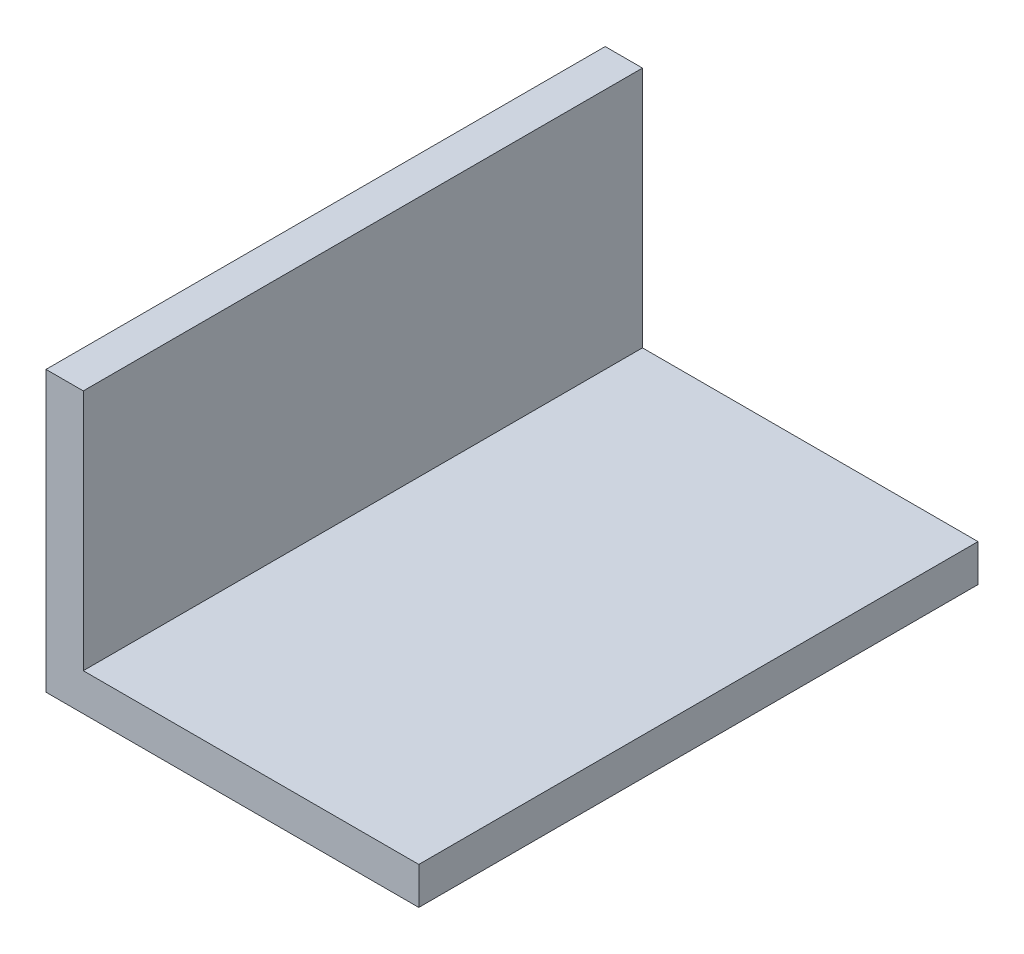
ISO-10303-21;
HEADER;
FILE_DESCRIPTION(('STEP AP214'),'2;1');
FILE_NAME('part.step','',(''),(''),'','','');
FILE_SCHEMA(('AUTOMOTIVE_DESIGN { 1 0 10303 214 1 1 1 1 }'));
ENDSEC;
DATA;
#1=APPLICATION_CONTEXT('core data for automotive mechanical design processes');
#2=APPLICATION_PROTOCOL_DEFINITION('international standard','automotive_design',2000,#1);
#3=PRODUCT_CONTEXT('',#1,'mechanical');
#4=PRODUCT('Part','Part','',(#3));
#5=PRODUCT_RELATED_PRODUCT_CATEGORY('part','',(#4));
#6=PRODUCT_DEFINITION_FORMATION('','',#4);
#7=PRODUCT_DEFINITION_CONTEXT('part definition',#1,'design');
#8=PRODUCT_DEFINITION('design','',#6,#7);
#9=PRODUCT_DEFINITION_SHAPE('','',#8);
#10=(LENGTH_UNIT() NAMED_UNIT(*) SI_UNIT(.MILLI.,.METRE.));
#11=(NAMED_UNIT(*) PLANE_ANGLE_UNIT() SI_UNIT($,.RADIAN.));
#12=(NAMED_UNIT(*) SI_UNIT($,.STERADIAN.) SOLID_ANGLE_UNIT());
#13=UNCERTAINTY_MEASURE_WITH_UNIT(LENGTH_MEASURE(1.E-05),#10,'distance_accuracy_value','');
#14=(GEOMETRIC_REPRESENTATION_CONTEXT(3) GLOBAL_UNCERTAINTY_ASSIGNED_CONTEXT((#13)) GLOBAL_UNIT_ASSIGNED_CONTEXT((#10,
#11,#12)) REPRESENTATION_CONTEXT('',''));
#15=CARTESIAN_POINT('',(0.,0.,0.));
#16=DIRECTION('',(0.,0.,1.));
#17=DIRECTION('',(1.,0.,0.));
#18=AXIS2_PLACEMENT_3D('',#15,#16,#17);
#19=CARTESIAN_POINT('',(34.,20.4000000000002,85.));
#20=DIRECTION('',(0.,0.,1.));
#21=DIRECTION('',(0.,-1.,0.));
#22=AXIS2_PLACEMENT_3D('',#19,#20,#21);
#23=PLANE('',#22);
#24=DIRECTION('',(1.,0.,0.));
#25=VECTOR('',#24,1.);
#26=CARTESIAN_POINT('',(68.,-1.69999999999982,85.));
#27=LINE('',#26,#25);
#28=CARTESIAN_POINT('',(37.4,-1.69999999999982,85.));
#29=VERTEX_POINT('',#28);
#30=CARTESIAN_POINT('',(68.,-1.69999999999982,85.));
#31=VERTEX_POINT('',#30);
#32=EDGE_CURVE('E50',#29,#31,#27,.T.);
#33=ORIENTED_EDGE('',*,*,#32,.F.);
#34=DIRECTION('',(0.,-1.,0.));
#35=VECTOR('',#34,1.);
#36=CARTESIAN_POINT('',(37.4,20.4000000000002,85.));
#37=LINE('',#36,#35);
#38=CARTESIAN_POINT('',(37.4,20.4000000000002,85.));
#39=VERTEX_POINT('',#38);
#40=EDGE_CURVE('E136',#39,#29,#37,.T.);
#41=ORIENTED_EDGE('',*,*,#40,.F.);
#42=DIRECTION('',(1.,0.,0.));
#43=VECTOR('',#42,1.);
#44=CARTESIAN_POINT('',(34.,20.4000000000002,85.));
#45=LINE('',#44,#43);
#46=CARTESIAN_POINT('',(34.,20.4000000000002,85.));
#47=VERTEX_POINT('',#46);
#48=EDGE_CURVE('E11',#47,#39,#45,.T.);
#49=ORIENTED_EDGE('',*,*,#48,.F.);
#50=DIRECTION('',(0.,-1.,0.));
#51=VECTOR('',#50,1.);
#52=CARTESIAN_POINT('',(34.,20.4000000000002,85.));
#53=LINE('',#52,#51);
#54=CARTESIAN_POINT('',(34.,-5.09999999999982,85.));
#55=VERTEX_POINT('',#54);
#56=EDGE_CURVE('E120',#47,#55,#53,.T.);
#57=ORIENTED_EDGE('',*,*,#56,.T.);
#58=DIRECTION('',(1.,0.,0.));
#59=VECTOR('',#58,1.);
#60=CARTESIAN_POINT('',(34.,-5.09999999999982,85.));
#61=LINE('',#60,#59);
#62=CARTESIAN_POINT('',(68.,-5.09999999999982,85.));
#63=VERTEX_POINT('',#62);
#64=EDGE_CURVE('E37',#55,#63,#61,.T.);
#65=ORIENTED_EDGE('',*,*,#64,.T.);
#66=DIRECTION('',(0.,-1.,0.));
#67=VECTOR('',#66,1.);
#68=CARTESIAN_POINT('',(68.,20.4000000000002,85.));
#69=LINE('',#68,#67);
#70=EDGE_CURVE('E124',#31,#63,#69,.T.);
#71=ORIENTED_EDGE('',*,*,#70,.F.);
#72=EDGE_LOOP('',(#33,#41,#49,#57,#65,#71));
#73=FACE_BOUND('',#72,.T.);
#74=ADVANCED_FACE('F34',(#73),#23,.T.);
#75=CARTESIAN_POINT('',(34.,20.4000000000002,34.));
#76=DIRECTION('',(0.,1.,0.));
#77=DIRECTION('',(0.,0.,1.));
#78=AXIS2_PLACEMENT_3D('',#75,#76,#77);
#79=PLANE('',#78);
#80=DIRECTION('',(0.,0.,1.));
#81=VECTOR('',#80,1.);
#82=CARTESIAN_POINT('',(37.4,20.4000000000002,34.));
#83=LINE('',#82,#81);
#84=CARTESIAN_POINT('',(37.4,20.4000000000002,34.));
#85=VERTEX_POINT('',#84);
#86=EDGE_CURVE('E98',#85,#39,#83,.T.);
#87=ORIENTED_EDGE('',*,*,#86,.F.);
#88=DIRECTION('',(1.,0.,0.));
#89=VECTOR('',#88,1.);
#90=CARTESIAN_POINT('',(34.,20.4000000000002,34.));
#91=LINE('',#90,#89);
#92=CARTESIAN_POINT('',(34.,20.4000000000002,34.));
#93=VERTEX_POINT('',#92);
#94=EDGE_CURVE('E42',#93,#85,#91,.T.);
#95=ORIENTED_EDGE('',*,*,#94,.F.);
#96=DIRECTION('',(0.,0.,1.));
#97=VECTOR('',#96,1.);
#98=CARTESIAN_POINT('',(34.,20.4000000000002,34.));
#99=LINE('',#98,#97);
#100=EDGE_CURVE('E127',#93,#47,#99,.T.);
#101=ORIENTED_EDGE('',*,*,#100,.T.);
#102=ORIENTED_EDGE('',*,*,#48,.T.);
#103=EDGE_LOOP('',(#87,#95,#101,#102));
#104=FACE_BOUND('',#103,.T.);
#105=ADVANCED_FACE('F107',(#104),#79,.T.);
#106=CARTESIAN_POINT('',(34.,-5.09999999999982,34.));
#107=DIRECTION('',(0.,0.,-1.));
#108=DIRECTION('',(-1.,0.,0.));
#109=AXIS2_PLACEMENT_3D('',#106,#107,#108);
#110=PLANE('',#109);
#111=DIRECTION('',(1.,0.,0.));
#112=VECTOR('',#111,1.);
#113=CARTESIAN_POINT('',(68.,-1.69999999999982,34.));
#114=LINE('',#113,#112);
#115=CARTESIAN_POINT('',(37.4,-1.69999999999982,34.));
#116=VERTEX_POINT('',#115);
#117=CARTESIAN_POINT('',(68.,-1.69999999999982,34.));
#118=VERTEX_POINT('',#117);
#119=EDGE_CURVE('E104',#116,#118,#114,.T.);
#120=ORIENTED_EDGE('',*,*,#119,.T.);
#121=DIRECTION('',(0.,1.,0.));
#122=VECTOR('',#121,1.);
#123=CARTESIAN_POINT('',(68.,-5.09999999999982,34.));
#124=LINE('',#123,#122);
#125=CARTESIAN_POINT('',(68.,-5.09999999999982,34.));
#126=VERTEX_POINT('',#125);
#127=EDGE_CURVE('E117',#126,#118,#124,.T.);
#128=ORIENTED_EDGE('',*,*,#127,.F.);
#129=DIRECTION('',(1.,0.,0.));
#130=VECTOR('',#129,1.);
#131=CARTESIAN_POINT('',(34.,-5.09999999999982,34.));
#132=LINE('',#131,#130);
#133=CARTESIAN_POINT('',(34.,-5.09999999999982,34.));
#134=VERTEX_POINT('',#133);
#135=EDGE_CURVE('E74',#134,#126,#132,.T.);
#136=ORIENTED_EDGE('',*,*,#135,.F.);
#137=DIRECTION('',(0.,1.,0.));
#138=VECTOR('',#137,1.);
#139=CARTESIAN_POINT('',(34.,-5.09999999999982,34.));
#140=LINE('',#139,#138);
#141=EDGE_CURVE('E113',#134,#93,#140,.T.);
#142=ORIENTED_EDGE('',*,*,#141,.T.);
#143=ORIENTED_EDGE('',*,*,#94,.T.);
#144=DIRECTION('',(0.,-1.,0.));
#145=VECTOR('',#144,1.);
#146=CARTESIAN_POINT('',(37.4,20.4000000000002,34.));
#147=LINE('',#146,#145);
#148=EDGE_CURVE('E94',#85,#116,#147,.T.);
#149=ORIENTED_EDGE('',*,*,#148,.T.);
#150=EDGE_LOOP('',(#120,#128,#136,#142,#143,#149));
#151=FACE_BOUND('',#150,.T.);
#152=ADVANCED_FACE('F111',(#151),#110,.T.);
#153=CARTESIAN_POINT('',(34.,-5.09999999999982,85.));
#154=DIRECTION('',(0.,-1.,0.));
#155=DIRECTION('',(0.,0.,-1.));
#156=AXIS2_PLACEMENT_3D('',#153,#154,#155);
#157=PLANE('',#156);
#158=DIRECTION('',(0.,0.,-1.));
#159=VECTOR('',#158,1.);
#160=CARTESIAN_POINT('',(68.,-5.09999999999982,85.));
#161=LINE('',#160,#159);
#162=EDGE_CURVE('E121',#63,#126,#161,.T.);
#163=ORIENTED_EDGE('',*,*,#162,.F.);
#164=ORIENTED_EDGE('',*,*,#64,.F.);
#165=DIRECTION('',(0.,0.,-1.));
#166=VECTOR('',#165,1.);
#167=CARTESIAN_POINT('',(34.,-5.09999999999982,85.));
#168=LINE('',#167,#166);
#169=EDGE_CURVE('E130',#55,#134,#168,.T.);
#170=ORIENTED_EDGE('',*,*,#169,.T.);
#171=ORIENTED_EDGE('',*,*,#135,.T.);
#172=EDGE_LOOP('',(#163,#164,#170,#171));
#173=FACE_BOUND('',#172,.T.);
#174=ADVANCED_FACE('F141',(#173),#157,.T.);
#175=CARTESIAN_POINT('',(34.,0.,0.));
#176=DIRECTION('',(1.,0.,0.));
#177=DIRECTION('',(0.,0.,-1.));
#178=AXIS2_PLACEMENT_3D('',#175,#176,#177);
#179=PLANE('',#178);
#180=ORIENTED_EDGE('',*,*,#56,.F.);
#181=ORIENTED_EDGE('',*,*,#100,.F.);
#182=ORIENTED_EDGE('',*,*,#141,.F.);
#183=ORIENTED_EDGE('',*,*,#169,.F.);
#184=EDGE_LOOP('',(#180,#181,#182,#183));
#185=FACE_BOUND('',#184,.T.);
#186=ADVANCED_FACE('F143',(#185),#179,.F.);
#187=CARTESIAN_POINT('',(68.,0.,0.));
#188=DIRECTION('',(1.,0.,0.));
#189=DIRECTION('',(0.,0.,-1.));
#190=AXIS2_PLACEMENT_3D('',#187,#188,#189);
#191=PLANE('',#190);
#192=DIRECTION('',(0.,0.,1.));
#193=VECTOR('',#192,1.);
#194=CARTESIAN_POINT('',(68.,-1.69999999999982,34.));
#195=LINE('',#194,#193);
#196=EDGE_CURVE('E126',#118,#31,#195,.T.);
#197=ORIENTED_EDGE('',*,*,#196,.T.);
#198=ORIENTED_EDGE('',*,*,#70,.T.);
#199=ORIENTED_EDGE('',*,*,#162,.T.);
#200=ORIENTED_EDGE('',*,*,#127,.T.);
#201=EDGE_LOOP('',(#197,#198,#199,#200));
#202=FACE_BOUND('',#201,.T.);
#203=ADVANCED_FACE('F139',(#202),#191,.T.);
#204=CARTESIAN_POINT('',(68.,-1.69999999999982,34.));
#205=DIRECTION('',(0.,-1.,0.));
#206=DIRECTION('',(1.,0.,0.));
#207=AXIS2_PLACEMENT_3D('',#204,#205,#206);
#208=PLANE('',#207);
#209=ORIENTED_EDGE('',*,*,#32,.T.);
#210=ORIENTED_EDGE('',*,*,#196,.F.);
#211=ORIENTED_EDGE('',*,*,#119,.F.);
#212=DIRECTION('',(0.,0.,1.));
#213=VECTOR('',#212,1.);
#214=CARTESIAN_POINT('',(37.4,-1.69999999999982,34.));
#215=LINE('',#214,#213);
#216=EDGE_CURVE('E99',#116,#29,#215,.T.);
#217=ORIENTED_EDGE('',*,*,#216,.T.);
#218=EDGE_LOOP('',(#209,#210,#211,#217));
#219=FACE_BOUND('',#218,.T.);
#220=ADVANCED_FACE('F160',(#219),#208,.F.);
#221=CARTESIAN_POINT('',(37.4,20.4000000000002,34.));
#222=DIRECTION('',(-1.,0.,0.));
#223=DIRECTION('',(0.,0.,1.));
#224=AXIS2_PLACEMENT_3D('',#221,#222,#223);
#225=PLANE('',#224);
#226=ORIENTED_EDGE('',*,*,#40,.T.);
#227=ORIENTED_EDGE('',*,*,#216,.F.);
#228=ORIENTED_EDGE('',*,*,#148,.F.);
#229=ORIENTED_EDGE('',*,*,#86,.T.);
#230=EDGE_LOOP('',(#226,#227,#228,#229));
#231=FACE_BOUND('',#230,.T.);
#232=ADVANCED_FACE('F97',(#231),#225,.F.);
#233=CLOSED_SHELL('',(#74,#105,#152,#174,#186,#203,#220,#232));
#234=MANIFOLD_SOLID_BREP('B2',#233);
#235=ADVANCED_BREP_SHAPE_REPRESENTATION('',(#18,#234),#14);
#236=SHAPE_DEFINITION_REPRESENTATION(#9,#235);
ENDSEC;
END-ISO-10303-21;
